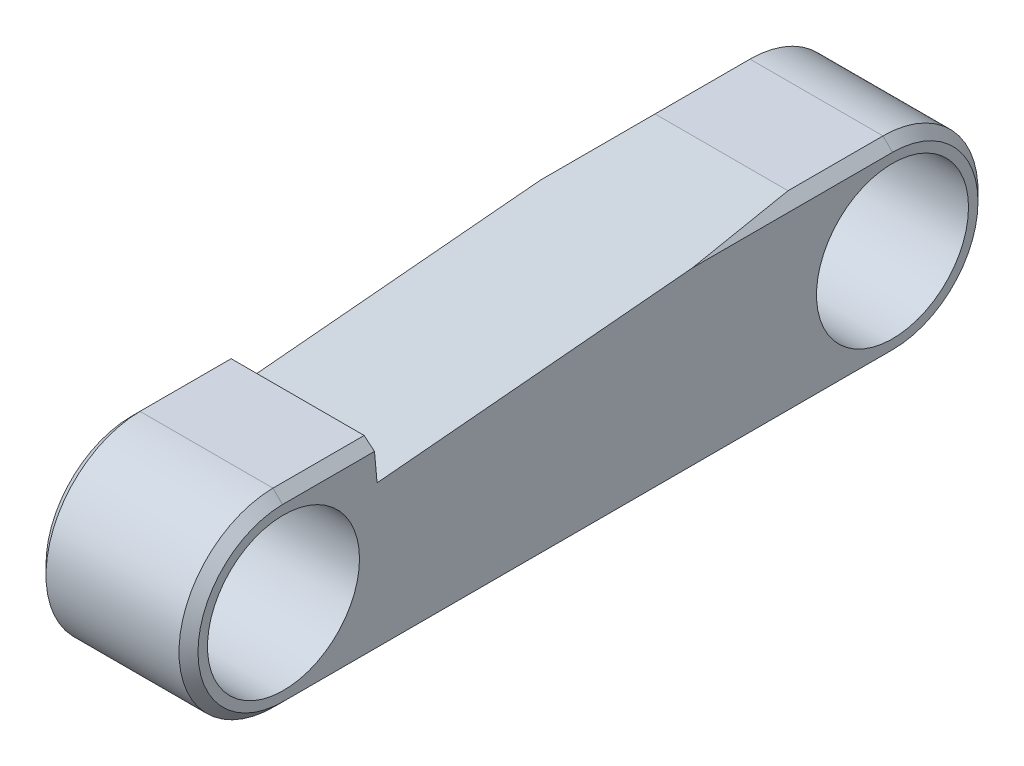
ISO-10303-21;
HEADER;
FILE_DESCRIPTION(('STEP AP214'),'2;1');
FILE_NAME('part.step','',(''),(''),'','','');
FILE_SCHEMA(('AUTOMOTIVE_DESIGN { 1 0 10303 214 1 1 1 1 }'));
ENDSEC;
DATA;
#1=APPLICATION_CONTEXT('core data for automotive mechanical design processes');
#2=APPLICATION_PROTOCOL_DEFINITION('international standard','automotive_design',2000,#1);
#3=PRODUCT_CONTEXT('',#1,'mechanical');
#4=PRODUCT('Part','Part','',(#3));
#5=PRODUCT_RELATED_PRODUCT_CATEGORY('part','',(#4));
#6=PRODUCT_DEFINITION_FORMATION('','',#4);
#7=PRODUCT_DEFINITION_CONTEXT('part definition',#1,'design');
#8=PRODUCT_DEFINITION('design','',#6,#7);
#9=PRODUCT_DEFINITION_SHAPE('','',#8);
#10=(LENGTH_UNIT() NAMED_UNIT(*) SI_UNIT(.MILLI.,.METRE.));
#11=(NAMED_UNIT(*) PLANE_ANGLE_UNIT() SI_UNIT($,.RADIAN.));
#12=(NAMED_UNIT(*) SI_UNIT($,.STERADIAN.) SOLID_ANGLE_UNIT());
#13=UNCERTAINTY_MEASURE_WITH_UNIT(LENGTH_MEASURE(1.E-05),#10,'distance_accuracy_value','');
#14=(GEOMETRIC_REPRESENTATION_CONTEXT(3) GLOBAL_UNCERTAINTY_ASSIGNED_CONTEXT((#13)) GLOBAL_UNIT_ASSIGNED_CONTEXT((#10,
#11,#12)) REPRESENTATION_CONTEXT('',''));
#15=CARTESIAN_POINT('',(0.,0.,0.));
#16=DIRECTION('',(0.,0.,1.));
#17=DIRECTION('',(1.,0.,0.));
#18=AXIS2_PLACEMENT_3D('',#15,#16,#17);
#19=CARTESIAN_POINT('',(8.,0.000592852956836885,-26.9028319761233));
#20=DIRECTION('',(-1.,0.,0.));
#21=DIRECTION('',(0.,0.,1.));
#22=AXIS2_PLACEMENT_3D('',#19,#20,#21);
#23=PLANE('',#22);
#24=CARTESIAN_POINT('',(8.,0.000592852956836885,-26.9028319761233));
#25=DIRECTION('',(-1.,0.,0.));
#26=DIRECTION('',(0.,0.,1.));
#27=AXIS2_PLACEMENT_3D('',#24,#25,#26);
#28=CIRCLE('',#27,4.50000000000001);
#29=CARTESIAN_POINT('',(8.,-4.49940714704317,-26.9028319761233));
#30=VERTEX_POINT('',#29);
#31=CARTESIAN_POINT('',(8.,4.50059285295684,-26.9028319761233));
#32=VERTEX_POINT('',#31);
#33=EDGE_CURVE('E54',#30,#32,#28,.F.);
#34=ORIENTED_EDGE('',*,*,#33,.T.);
#35=DIRECTION('',(0.,0.,1.));
#36=VECTOR('',#35,1.);
#37=CARTESIAN_POINT('',(8.,4.50059285295684,-26.9028319761233));
#38=LINE('',#37,#36);
#39=CARTESIAN_POINT('',(8.,4.50059285295684,-16.3724584459279));
#40=VERTEX_POINT('',#39);
#41=EDGE_CURVE('E11',#32,#40,#38,.T.);
#42=ORIENTED_EDGE('',*,*,#41,.T.);
#43=DIRECTION('',(0.,-0.09004255440515,0.995937918946857));
#44=VECTOR('',#43,1.);
#45=CARTESIAN_POINT('',(8.,5.00059285295684,-21.9028319761233));
#46=LINE('',#45,#44);
#47=CARTESIAN_POINT('',(8.,3.00000021515595,0.225217161472685));
#48=VERTEX_POINT('',#47);
#49=EDGE_CURVE('E139',#40,#48,#46,.T.);
#50=ORIENTED_EDGE('',*,*,#49,.T.);
#51=DIRECTION('',(0.,0.995937918946854,0.0900425544051859));
#52=VECTOR('',#51,1.);
#53=CARTESIAN_POINT('',(8.,3.00000021515595,0.225217161472685));
#54=LINE('',#53,#52);
#55=CARTESIAN_POINT('',(8.,4.50000021515595,0.360831871022656));
#56=VERTEX_POINT('',#55);
#57=EDGE_CURVE('E143',#48,#56,#54,.T.);
#58=ORIENTED_EDGE('',*,*,#57,.T.);
#59=DIRECTION('',(0.,0.,1.));
#60=VECTOR('',#59,1.);
#61=CARTESIAN_POINT('',(8.,4.50000021515596,-26.9028319761233));
#62=LINE('',#61,#60);
#63=CARTESIAN_POINT('',(8.,4.50000021515595,5.20324329658501));
#64=VERTEX_POINT('',#63);
#65=EDGE_CURVE('E254',#56,#64,#62,.T.);
#66=ORIENTED_EDGE('',*,*,#65,.T.);
#67=CARTESIAN_POINT('',(8.,0.000296534056391882,5.15160239904135));
#68=DIRECTION('',(-1.,0.,0.));
#69=DIRECTION('',(0.,0.,1.));
#70=AXIS2_PLACEMENT_3D('',#67,#68,#69);
#71=CIRCLE('',#70,4.50000000000001);
#72=CARTESIAN_POINT('',(8.,-4.49940714704317,5.09996150149768));
#73=VERTEX_POINT('',#72);
#74=EDGE_CURVE('E257',#64,#73,#71,.F.);
#75=ORIENTED_EDGE('',*,*,#74,.T.);
#76=DIRECTION('',(0.,0.,-1.));
#77=VECTOR('',#76,1.);
#78=CARTESIAN_POINT('',(8.,-4.49940714704317,-26.9028319761233));
#79=LINE('',#78,#77);
#80=EDGE_CURVE('E65',#73,#30,#79,.T.);
#81=ORIENTED_EDGE('',*,*,#80,.T.);
#82=EDGE_LOOP('',(#34,#42,#50,#58,#66,#75,#81));
#83=FACE_BOUND('',#82,.T.);
#84=CARTESIAN_POINT('',(8.,0.000592852956836885,-26.9028319761233));
#85=DIRECTION('',(1.,0.,0.));
#86=DIRECTION('',(0.,0.,-1.));
#87=AXIS2_PLACEMENT_3D('',#84,#85,#86);
#88=CIRCLE('',#87,4.);
#89=CARTESIAN_POINT('',(8.,0.000592852956836885,-30.9028319761233));
#90=VERTEX_POINT('',#89);
#91=EDGE_CURVE('E178',#90,#90,#88,.T.);
#92=ORIENTED_EDGE('',*,*,#91,.F.);
#93=EDGE_LOOP('',(#92));
#94=FACE_BOUND('',#93,.T.);
#95=CARTESIAN_POINT('',(8.,0.000296534056391882,5.15160239904135));
#96=DIRECTION('',(1.,0.,0.));
#97=DIRECTION('',(0.,0.,-1.));
#98=AXIS2_PLACEMENT_3D('',#95,#96,#97);
#99=CIRCLE('',#98,3.99999999998631);
#100=CARTESIAN_POINT('',(8.,0.000296534056391882,1.15160239905504));
#101=VERTEX_POINT('',#100);
#102=EDGE_CURVE('E365',#101,#101,#99,.T.);
#103=ORIENTED_EDGE('',*,*,#102,.F.);
#104=EDGE_LOOP('',(#103));
#105=FACE_BOUND('',#104,.T.);
#106=ADVANCED_FACE('F39',(#83,#94,#105),#23,.F.);
#107=CARTESIAN_POINT('',(0.,0.000592852956836885,-26.9028319761233));
#108=DIRECTION('',(-1.,0.,0.));
#109=DIRECTION('',(0.,0.,1.));
#110=AXIS2_PLACEMENT_3D('',#107,#108,#109);
#111=PLANE('',#110);
#112=CARTESIAN_POINT('',(0.,0.000592852956836885,-26.9028319761233));
#113=DIRECTION('',(1.,0.,0.));
#114=DIRECTION('',(0.,0.,-1.));
#115=AXIS2_PLACEMENT_3D('',#112,#113,#114);
#116=CIRCLE('',#115,4.);
#117=CARTESIAN_POINT('',(0.,0.000592852956836885,-30.9028319761233));
#118=VERTEX_POINT('',#117);
#119=EDGE_CURVE('E369',#118,#118,#116,.T.);
#120=ORIENTED_EDGE('',*,*,#119,.T.);
#121=EDGE_LOOP('',(#120));
#122=FACE_BOUND('',#121,.T.);
#123=DIRECTION('',(0.,-0.09004255440515,0.995937918946857));
#124=VECTOR('',#123,1.);
#125=CARTESIAN_POINT('',(0.,5.00059285295684,-21.9028319761233));
#126=LINE('',#125,#124);
#127=CARTESIAN_POINT('',(0.,4.50059285295684,-16.3724584459279));
#128=VERTEX_POINT('',#127);
#129=CARTESIAN_POINT('',(0.,3.00000021515595,0.225217161472685));
#130=VERTEX_POINT('',#129);
#131=EDGE_CURVE('E155',#128,#130,#126,.T.);
#132=ORIENTED_EDGE('',*,*,#131,.F.);
#133=DIRECTION('',(0.,0.,-1.));
#134=VECTOR('',#133,1.);
#135=CARTESIAN_POINT('',(0.,4.50059285295684,-26.9028319761233));
#136=LINE('',#135,#134);
#137=CARTESIAN_POINT('',(0.,4.50059285295684,-26.9028319761233));
#138=VERTEX_POINT('',#137);
#139=EDGE_CURVE('E222',#128,#138,#136,.T.);
#140=ORIENTED_EDGE('',*,*,#139,.T.);
#141=CARTESIAN_POINT('',(0.,0.000592852956836885,-26.9028319761233));
#142=DIRECTION('',(-1.,0.,0.));
#143=DIRECTION('',(0.,0.,1.));
#144=AXIS2_PLACEMENT_3D('',#141,#142,#143);
#145=CIRCLE('',#144,4.5);
#146=CARTESIAN_POINT('',(0.,-4.49940714704317,-26.9028319761233));
#147=VERTEX_POINT('',#146);
#148=EDGE_CURVE('E219',#138,#147,#145,.T.);
#149=ORIENTED_EDGE('',*,*,#148,.T.);
#150=DIRECTION('',(0.,0.,1.));
#151=VECTOR('',#150,1.);
#152=CARTESIAN_POINT('',(0.,-4.49940714704317,5.09716802387673));
#153=LINE('',#152,#151);
#154=CARTESIAN_POINT('',(0.,-4.49940714704317,5.0999615014976));
#155=VERTEX_POINT('',#154);
#156=EDGE_CURVE('E216',#147,#155,#153,.T.);
#157=ORIENTED_EDGE('',*,*,#156,.T.);
#158=CARTESIAN_POINT('',(0.,0.000296534056391882,5.15160239904135));
#159=DIRECTION('',(-1.,0.,0.));
#160=DIRECTION('',(0.,0.,1.));
#161=AXIS2_PLACEMENT_3D('',#158,#159,#160);
#162=CIRCLE('',#161,4.5);
#163=CARTESIAN_POINT('',(0.,4.50000021515595,5.20324329658509));
#164=VERTEX_POINT('',#163);
#165=EDGE_CURVE('E213',#155,#164,#162,.T.);
#166=ORIENTED_EDGE('',*,*,#165,.T.);
#167=DIRECTION('',(0.,0.,-1.));
#168=VECTOR('',#167,1.);
#169=CARTESIAN_POINT('',(0.,4.50000021515595,0.406036774205978));
#170=LINE('',#169,#168);
#171=CARTESIAN_POINT('',(0.,4.50000021515595,0.360831871022655));
#172=VERTEX_POINT('',#171);
#173=EDGE_CURVE('E210',#164,#172,#170,.T.);
#174=ORIENTED_EDGE('',*,*,#173,.T.);
#175=DIRECTION('',(0.,0.995937918946854,0.0900425544051859));
#176=VECTOR('',#175,1.);
#177=CARTESIAN_POINT('',(0.,3.00000021515595,0.225217161472685));
#178=LINE('',#177,#176);
#179=EDGE_CURVE('E148',#130,#172,#178,.T.);
#180=ORIENTED_EDGE('',*,*,#179,.F.);
#181=EDGE_LOOP('',(#132,#140,#149,#157,#166,#174,#180));
#182=FACE_BOUND('',#181,.T.);
#183=CARTESIAN_POINT('',(0.,0.000296534056391882,5.15160239904135));
#184=DIRECTION('',(1.,0.,0.));
#185=DIRECTION('',(0.,0.,-1.));
#186=AXIS2_PLACEMENT_3D('',#183,#184,#185);
#187=CIRCLE('',#186,3.99999999998631);
#188=CARTESIAN_POINT('',(0.,0.000296534056391882,1.15160239905504));
#189=VERTEX_POINT('',#188);
#190=EDGE_CURVE('E362',#189,#189,#187,.T.);
#191=ORIENTED_EDGE('',*,*,#190,.T.);
#192=EDGE_LOOP('',(#191));
#193=FACE_BOUND('',#192,.T.);
#194=ADVANCED_FACE('F381',(#122,#182,#193),#111,.T.);
#195=CARTESIAN_POINT('',(8.,0.000592852956836885,-26.9028319761233));
#196=DIRECTION('',(-1.,0.,0.));
#197=DIRECTION('',(0.,0.,1.));
#198=AXIS2_PLACEMENT_3D('',#195,#196,#197);
#199=CYLINDRICAL_SURFACE('',#198,5.);
#200=DIRECTION('',(-1.,0.,0.));
#201=VECTOR('',#200,1.);
#202=CARTESIAN_POINT('',(8.,-4.99940714704316,-26.9028319761233));
#203=LINE('',#202,#201);
#204=CARTESIAN_POINT('',(7.5,-4.99940714704316,-26.9028319761233));
#205=VERTEX_POINT('',#204);
#206=CARTESIAN_POINT('',(0.499999999999994,-4.99940714704316,-26.9028319761233));
#207=VERTEX_POINT('',#206);
#208=EDGE_CURVE('E168',#205,#207,#203,.T.);
#209=ORIENTED_EDGE('',*,*,#208,.T.);
#210=CARTESIAN_POINT('',(0.499999999999994,0.000592852956836885,-26.9028319761233));
#211=DIRECTION('',(-1.,0.,0.));
#212=DIRECTION('',(0.,0.,1.));
#213=AXIS2_PLACEMENT_3D('',#210,#211,#212);
#214=CIRCLE('',#213,5.);
#215=CARTESIAN_POINT('',(0.499999999999994,5.00059285295684,-26.9028319761233));
#216=VERTEX_POINT('',#215);
#217=EDGE_CURVE('E228',#207,#216,#214,.F.);
#218=ORIENTED_EDGE('',*,*,#217,.T.);
#219=DIRECTION('',(-1.,0.,0.));
#220=VECTOR('',#219,1.);
#221=CARTESIAN_POINT('',(8.,5.00059285295684,-26.9028319761233));
#222=LINE('',#221,#220);
#223=CARTESIAN_POINT('',(7.5,5.00059285295684,-26.9028319761233));
#224=VERTEX_POINT('',#223);
#225=EDGE_CURVE('E193',#224,#216,#222,.T.);
#226=ORIENTED_EDGE('',*,*,#225,.F.);
#227=CARTESIAN_POINT('',(7.5,0.000592852956836885,-26.9028319761233));
#228=DIRECTION('',(-1.,0.,0.));
#229=DIRECTION('',(0.,0.,1.));
#230=AXIS2_PLACEMENT_3D('',#227,#228,#229);
#231=CIRCLE('',#230,5.);
#232=EDGE_CURVE('E225',#224,#205,#231,.T.);
#233=ORIENTED_EDGE('',*,*,#232,.T.);
#234=EDGE_LOOP('',(#209,#218,#226,#233));
#235=FACE_BOUND('',#234,.T.);
#236=ADVANCED_FACE('F336',(#235),#199,.T.);
#237=CARTESIAN_POINT('',(8.,5.00059285295684,-21.9028319761233));
#238=DIRECTION('',(0.,-1.,0.));
#239=DIRECTION('',(0.,0.,-1.));
#240=AXIS2_PLACEMENT_3D('',#237,#238,#239);
#241=PLANE('',#240);
#242=ORIENTED_EDGE('',*,*,#225,.T.);
#243=DIRECTION('',(0.,0.,1.));
#244=VECTOR('',#243,1.);
#245=CARTESIAN_POINT('',(0.499999999999994,5.00059285295684,-21.9028319761233));
#246=LINE('',#245,#244);
#247=CARTESIAN_POINT('',(0.499999999999994,5.00059285295684,-21.9028319761233));
#248=VERTEX_POINT('',#247);
#249=EDGE_CURVE('E200',#216,#248,#246,.T.);
#250=ORIENTED_EDGE('',*,*,#249,.T.);
#251=DIRECTION('',(-1.,0.,0.));
#252=VECTOR('',#251,1.);
#253=CARTESIAN_POINT('',(8.,5.00059285295684,-21.9028319761233));
#254=LINE('',#253,#252);
#255=CARTESIAN_POINT('',(7.5,5.00059285295684,-21.9028319761233));
#256=VERTEX_POINT('',#255);
#257=EDGE_CURVE('E160',#256,#248,#254,.T.);
#258=ORIENTED_EDGE('',*,*,#257,.F.);
#259=DIRECTION('',(0.,0.,-1.));
#260=VECTOR('',#259,1.);
#261=CARTESIAN_POINT('',(7.5,5.00059285295684,-21.9028319761233));
#262=LINE('',#261,#260);
#263=EDGE_CURVE('E197',#256,#224,#262,.T.);
#264=ORIENTED_EDGE('',*,*,#263,.T.);
#265=EDGE_LOOP('',(#242,#250,#258,#264));
#266=FACE_BOUND('',#265,.T.);
#267=ADVANCED_FACE('F396',(#266),#241,.F.);
#268=CARTESIAN_POINT('',(8.,5.00059285295684,-21.9028319761233));
#269=DIRECTION('',(0.,-0.995937918946857,-0.09004255440515));
#270=DIRECTION('',(0.,0.09004255440515,-0.995937918946857));
#271=AXIS2_PLACEMENT_3D('',#268,#269,#270);
#272=PLANE('',#271);
#273=ORIENTED_EDGE('',*,*,#257,.T.);
#274=DIRECTION('',(-0.0896797418113597,-0.0896797418113603,0.991924940616625));
#275=VECTOR('',#274,1.);
#276=CARTESIAN_POINT('',(0.499999999999994,5.00059285295684,-21.9028319761233));
#277=LINE('',#276,#275);
#278=EDGE_CURVE('E207',#248,#128,#277,.T.);
#279=ORIENTED_EDGE('',*,*,#278,.T.);
#280=ORIENTED_EDGE('',*,*,#131,.T.);
#281=DIRECTION('',(-1.,0.,0.));
#282=VECTOR('',#281,1.);
#283=CARTESIAN_POINT('',(8.,3.00000021515595,0.225217161472685));
#284=LINE('',#283,#282);
#285=EDGE_CURVE('E151',#48,#130,#284,.T.);
#286=ORIENTED_EDGE('',*,*,#285,.F.);
#287=ORIENTED_EDGE('',*,*,#49,.F.);
#288=DIRECTION('',(0.089679741811361,-0.0896797418113603,0.991924940616625));
#289=VECTOR('',#288,1.);
#290=CARTESIAN_POINT('',(7.06326459323762,5.43732825971922,-26.733451842639));
#291=LINE('',#290,#289);
#292=EDGE_CURVE('E204',#40,#256,#291,.F.);
#293=ORIENTED_EDGE('',*,*,#292,.T.);
#294=EDGE_LOOP('',(#273,#279,#280,#286,#287,#293));
#295=FACE_BOUND('',#294,.T.);
#296=ADVANCED_FACE('F153',(#295),#272,.F.);
#297=CARTESIAN_POINT('',(8.,3.00000021515595,0.225217161472685));
#298=DIRECTION('',(0.,-0.0900425544051859,0.995937918946853));
#299=DIRECTION('',(0.,-0.995937918946854,-0.0900425544051859));
#300=AXIS2_PLACEMENT_3D('',#297,#298,#299);
#301=PLANE('',#300);
#302=ORIENTED_EDGE('',*,*,#179,.T.);
#303=DIRECTION('',(0.705666234406872,0.705666234406877,0.0637991476122063));
#304=VECTOR('',#303,1.);
#305=CARTESIAN_POINT('',(0.716100340418587,5.21610055557454,0.42557436413899));
#306=LINE('',#305,#304);
#307=CARTESIAN_POINT('',(0.499999999999994,5.00000021515595,0.406036774205978));
#308=VERTEX_POINT('',#307);
#309=EDGE_CURVE('E251',#172,#308,#306,.T.);
#310=ORIENTED_EDGE('',*,*,#309,.T.);
#311=DIRECTION('',(-1.,0.,0.));
#312=VECTOR('',#311,1.);
#313=CARTESIAN_POINT('',(8.,5.00000021515595,0.406036774205978));
#314=LINE('',#313,#312);
#315=CARTESIAN_POINT('',(7.5,5.00000021515595,0.406036774205978));
#316=VERTEX_POINT('',#315);
#317=EDGE_CURVE('E161',#316,#308,#314,.T.);
#318=ORIENTED_EDGE('',*,*,#317,.F.);
#319=DIRECTION('',(-0.705666234406877,0.705666234406872,0.0637991476122058));
#320=VECTOR('',#319,1.);
#321=CARTESIAN_POINT('',(9.22743479967215,3.27256541548381,0.249859728456616));
#322=LINE('',#321,#320);
#323=EDGE_CURVE('E166',#316,#56,#322,.F.);
#324=ORIENTED_EDGE('',*,*,#323,.T.);
#325=ORIENTED_EDGE('',*,*,#57,.F.);
#326=ORIENTED_EDGE('',*,*,#285,.T.);
#327=EDGE_LOOP('',(#302,#310,#318,#324,#325,#326));
#328=FACE_BOUND('',#327,.T.);
#329=ADVANCED_FACE('F163',(#328),#301,.F.);
#330=CARTESIAN_POINT('',(8.,5.00000021515595,5.20603677420597));
#331=DIRECTION('',(0.,-1.,0.));
#332=DIRECTION('',(0.,0.,-1.));
#333=AXIS2_PLACEMENT_3D('',#330,#331,#332);
#334=PLANE('',#333);
#335=ORIENTED_EDGE('',*,*,#317,.T.);
#336=DIRECTION('',(0.,0.,1.));
#337=VECTOR('',#336,1.);
#338=CARTESIAN_POINT('',(0.499999999999994,5.00000021515595,5.20603677420597));
#339=LINE('',#338,#337);
#340=CARTESIAN_POINT('',(0.499999999999994,5.00000021515595,5.20603677420597));
#341=VERTEX_POINT('',#340);
#342=EDGE_CURVE('E246',#308,#341,#339,.T.);
#343=ORIENTED_EDGE('',*,*,#342,.T.);
#344=DIRECTION('',(-1.,0.,0.));
#345=VECTOR('',#344,1.);
#346=CARTESIAN_POINT('',(8.,5.00000021515595,5.20603677420597));
#347=LINE('',#346,#345);
#348=CARTESIAN_POINT('',(7.5,5.00000021515595,5.20603677420597));
#349=VERTEX_POINT('',#348);
#350=EDGE_CURVE('E184',#349,#341,#347,.T.);
#351=ORIENTED_EDGE('',*,*,#350,.F.);
#352=DIRECTION('',(0.,0.,-1.));
#353=VECTOR('',#352,1.);
#354=CARTESIAN_POINT('',(7.5,5.00000021515595,5.20603677420597));
#355=LINE('',#354,#353);
#356=EDGE_CURVE('E243',#349,#316,#355,.T.);
#357=ORIENTED_EDGE('',*,*,#356,.T.);
#358=EDGE_LOOP('',(#335,#343,#351,#357));
#359=FACE_BOUND('',#358,.T.);
#360=ADVANCED_FACE('F355',(#359),#334,.F.);
#361=CARTESIAN_POINT('',(8.,0.000296534056391882,5.15160239904135));
#362=DIRECTION('',(-1.,0.,0.));
#363=DIRECTION('',(0.,0.,1.));
#364=AXIS2_PLACEMENT_3D('',#361,#362,#363);
#365=CYLINDRICAL_SURFACE('',#364,5.);
#366=ORIENTED_EDGE('',*,*,#350,.T.);
#367=CARTESIAN_POINT('',(0.499999999999994,0.000296534056391882,5.15160239904135));
#368=DIRECTION('',(-1.,0.,0.));
#369=DIRECTION('',(0.,0.,1.));
#370=AXIS2_PLACEMENT_3D('',#367,#368,#369);
#371=CIRCLE('',#370,5.);
#372=CARTESIAN_POINT('',(0.499999999999994,-4.99940714704316,5.09716802387673));
#373=VERTEX_POINT('',#372);
#374=EDGE_CURVE('E240',#341,#373,#371,.F.);
#375=ORIENTED_EDGE('',*,*,#374,.T.);
#376=DIRECTION('',(-1.,0.,0.));
#377=VECTOR('',#376,1.);
#378=CARTESIAN_POINT('',(8.,-4.99940714704316,5.09716802387673));
#379=LINE('',#378,#377);
#380=CARTESIAN_POINT('',(7.5,-4.99940714704316,5.09716802387673));
#381=VERTEX_POINT('',#380);
#382=EDGE_CURVE('E172',#381,#373,#379,.T.);
#383=ORIENTED_EDGE('',*,*,#382,.F.);
#384=CARTESIAN_POINT('',(7.5,0.000296534056391882,5.15160239904135));
#385=DIRECTION('',(-1.,0.,0.));
#386=DIRECTION('',(0.,0.,1.));
#387=AXIS2_PLACEMENT_3D('',#384,#385,#386);
#388=CIRCLE('',#387,5.);
#389=EDGE_CURVE('E237',#381,#349,#388,.T.);
#390=ORIENTED_EDGE('',*,*,#389,.T.);
#391=EDGE_LOOP('',(#366,#375,#383,#390));
#392=FACE_BOUND('',#391,.T.);
#393=ADVANCED_FACE('F351',(#392),#365,.T.);
#394=CARTESIAN_POINT('',(8.,-4.99940714704316,5.09716802387673));
#395=DIRECTION('',(0.,1.,0.));
#396=DIRECTION('',(0.,0.,1.));
#397=AXIS2_PLACEMENT_3D('',#394,#395,#396);
#398=PLANE('',#397);
#399=ORIENTED_EDGE('',*,*,#382,.T.);
#400=DIRECTION('',(0.,0.,-1.));
#401=VECTOR('',#400,1.);
#402=CARTESIAN_POINT('',(0.499999999999994,-4.99940714704316,-26.9028319761233));
#403=LINE('',#402,#401);
#404=EDGE_CURVE('E234',#373,#207,#403,.T.);
#405=ORIENTED_EDGE('',*,*,#404,.T.);
#406=ORIENTED_EDGE('',*,*,#208,.F.);
#407=DIRECTION('',(0.,0.,1.));
#408=VECTOR('',#407,1.);
#409=CARTESIAN_POINT('',(7.5,-4.99940714704316,5.09716802387673));
#410=LINE('',#409,#408);
#411=EDGE_CURVE('E231',#205,#381,#410,.T.);
#412=ORIENTED_EDGE('',*,*,#411,.T.);
#413=EDGE_LOOP('',(#399,#405,#406,#412));
#414=FACE_BOUND('',#413,.T.);
#415=ADVANCED_FACE('F340',(#414),#398,.F.);
#416=CARTESIAN_POINT('',(8.,0.000592852956836885,-26.9028319761233));
#417=DIRECTION('',(-1.,0.,0.));
#418=DIRECTION('',(0.,0.,1.));
#419=AXIS2_PLACEMENT_3D('',#416,#417,#418);
#420=CYLINDRICAL_SURFACE('',#419,4.);
#421=ORIENTED_EDGE('',*,*,#91,.T.);
#422=EDGE_LOOP('',(#421));
#423=FACE_BOUND('',#422,.T.);
#424=ORIENTED_EDGE('',*,*,#119,.F.);
#425=EDGE_LOOP('',(#424));
#426=FACE_BOUND('',#425,.T.);
#427=ADVANCED_FACE('F377',(#423,#426),#420,.F.);
#428=CARTESIAN_POINT('',(8.,0.000296534056391882,5.15160239904135));
#429=DIRECTION('',(-1.,0.,0.));
#430=DIRECTION('',(0.,0.,1.));
#431=AXIS2_PLACEMENT_3D('',#428,#429,#430);
#432=CYLINDRICAL_SURFACE('',#431,3.99999999998631);
#433=ORIENTED_EDGE('',*,*,#102,.T.);
#434=EDGE_LOOP('',(#433));
#435=FACE_BOUND('',#434,.T.);
#436=ORIENTED_EDGE('',*,*,#190,.F.);
#437=EDGE_LOOP('',(#436));
#438=FACE_BOUND('',#437,.T.);
#439=ADVANCED_FACE('F301',(#435,#438),#432,.F.);
#440=CARTESIAN_POINT('',(0.499999999999994,5.00000021515595,5.20603677420597));
#441=DIRECTION('',(-0.70710678118655,0.707106781186545,0.));
#442=DIRECTION('',(0.,0.,-1.));
#443=AXIS2_PLACEMENT_3D('',#440,#441,#442);
#444=PLANE('',#443);
#445=ORIENTED_EDGE('',*,*,#309,.F.);
#446=ORIENTED_EDGE('',*,*,#173,.F.);
#447=CARTESIAN_POINT('',(0.,4.50000021515595,5.20324329658509));
#448=CARTESIAN_POINT('',(0.0833332990949775,4.58333351425093,5.20372113697152));
#449=CARTESIAN_POINT('',(0.166666615315066,4.66666683047102,5.20419284696651));
#450=CARTESIAN_POINT('',(0.333333281981731,4.83333349713768,5.20512400617347));
#451=CARTESIAN_POINT('',(0.416666632428307,4.91666684758426,5.20558345538544));
#452=CARTESIAN_POINT('',(0.499999999999994,5.00000021515595,5.20603677420598));
#453=B_SPLINE_CURVE_WITH_KNOTS('',3,(#447,#448,#449,#450,#451,#452),.UNSPECIFIED.,.F.,.F.,(4,2,
4),(0.,0.353556150071169,0.707112300041635),.UNSPECIFIED.);
#454=EDGE_CURVE('E282',#341,#164,#453,.F.);
#455=ORIENTED_EDGE('',*,*,#454,.F.);
#456=ORIENTED_EDGE('',*,*,#342,.F.);
#457=EDGE_LOOP('',(#445,#446,#455,#456));
#458=FACE_BOUND('',#457,.T.);
#459=ADVANCED_FACE('F295',(#458),#444,.T.);
#460=CARTESIAN_POINT('',(0.499999999999994,0.000296534056391882,5.15160239904135));
#461=DIRECTION('',(1.,0.,0.));
#462=DIRECTION('',(0.,0.,-1.));
#463=AXIS2_PLACEMENT_3D('',#460,#461,#462);
#464=CONICAL_SURFACE('',#463,5.,0.785398163397452);
#465=ORIENTED_EDGE('',*,*,#454,.T.);
#466=ORIENTED_EDGE('',*,*,#165,.F.);
#467=CARTESIAN_POINT('',(0.,-4.49940714704317,5.0999615014976));
#468=CARTESIAN_POINT('',(0.0833332990949775,-4.58274044613814,5.09948366111116));
#469=CARTESIAN_POINT('',(0.166666615315066,-4.66607376235823,5.09901195111616));
#470=CARTESIAN_POINT('',(0.333333281981731,-4.8327404290249,5.09808079190919));
#471=CARTESIAN_POINT('',(0.416666632428306,-4.91607377947147,5.09762134269721));
#472=CARTESIAN_POINT('',(0.499999999999993,-4.99940714704316,5.09716802387667));
#473=B_SPLINE_CURVE_WITH_KNOTS('',3,(#467,#468,#469,#470,#471,#472),.UNSPECIFIED.,.F.,.F.,(4,2,
4),(0.,0.353556150071169,0.707112300041635),.UNSPECIFIED.);
#474=EDGE_CURVE('E272',#373,#155,#473,.F.);
#475=ORIENTED_EDGE('',*,*,#474,.F.);
#476=ORIENTED_EDGE('',*,*,#374,.F.);
#477=EDGE_LOOP('',(#465,#466,#475,#476));
#478=FACE_BOUND('',#477,.T.);
#479=ADVANCED_FACE('F292',(#478),#464,.T.);
#480=CARTESIAN_POINT('',(0.499999999999994,-4.99940714704316,5.09716802387673));
#481=DIRECTION('',(-0.70710678118655,-0.707106781186545,0.));
#482=DIRECTION('',(0.,0.,1.));
#483=AXIS2_PLACEMENT_3D('',#480,#481,#482);
#484=PLANE('',#483);
#485=ORIENTED_EDGE('',*,*,#474,.T.);
#486=ORIENTED_EDGE('',*,*,#156,.F.);
#487=DIRECTION('',(-0.707106781186545,0.70710678118655,0.));
#488=VECTOR('',#487,1.);
#489=CARTESIAN_POINT('',(0.499999999999994,-4.99940714704316,-26.9028319761233));
#490=LINE('',#489,#488);
#491=EDGE_CURVE('E268',#207,#147,#490,.T.);
#492=ORIENTED_EDGE('',*,*,#491,.F.);
#493=ORIENTED_EDGE('',*,*,#404,.F.);
#494=EDGE_LOOP('',(#485,#486,#492,#493));
#495=FACE_BOUND('',#494,.T.);
#496=ADVANCED_FACE('F289',(#495),#484,.T.);
#497=CARTESIAN_POINT('',(0.499999999999994,0.000592852956836885,-26.9028319761233));
#498=DIRECTION('',(1.,0.,0.));
#499=DIRECTION('',(0.,0.,-1.));
#500=AXIS2_PLACEMENT_3D('',#497,#498,#499);
#501=CONICAL_SURFACE('',#500,5.,0.785398163397452);
#502=ORIENTED_EDGE('',*,*,#491,.T.);
#503=ORIENTED_EDGE('',*,*,#148,.F.);
#504=DIRECTION('',(-0.707106781186545,-0.70710678118655,0.));
#505=VECTOR('',#504,1.);
#506=CARTESIAN_POINT('',(0.499999999999994,5.00059285295684,-26.9028319761233));
#507=LINE('',#506,#505);
#508=EDGE_CURVE('E264',#216,#138,#507,.T.);
#509=ORIENTED_EDGE('',*,*,#508,.F.);
#510=ORIENTED_EDGE('',*,*,#217,.F.);
#511=EDGE_LOOP('',(#502,#503,#509,#510));
#512=FACE_BOUND('',#511,.T.);
#513=ADVANCED_FACE('F416',(#512),#501,.T.);
#514=CARTESIAN_POINT('',(0.499999999999994,5.00059285295684,-21.9028319761233));
#515=DIRECTION('',(-0.70710678118655,0.707106781186545,0.));
#516=DIRECTION('',(0.,0.,-1.));
#517=AXIS2_PLACEMENT_3D('',#514,#515,#516);
#518=PLANE('',#517);
#519=ORIENTED_EDGE('',*,*,#508,.T.);
#520=ORIENTED_EDGE('',*,*,#139,.F.);
#521=ORIENTED_EDGE('',*,*,#278,.F.);
#522=ORIENTED_EDGE('',*,*,#249,.F.);
#523=EDGE_LOOP('',(#519,#520,#521,#522));
#524=FACE_BOUND('',#523,.T.);
#525=ADVANCED_FACE('F414',(#524),#518,.T.);
#526=CARTESIAN_POINT('',(8.,4.50000021515596,-26.9028319761233));
#527=DIRECTION('',(-0.707106781186545,-0.70710678118655,0.));
#528=DIRECTION('',(0.,0.,1.));
#529=AXIS2_PLACEMENT_3D('',#526,#527,#528);
#530=PLANE('',#529);
#531=ORIENTED_EDGE('',*,*,#323,.F.);
#532=ORIENTED_EDGE('',*,*,#356,.F.);
#533=CARTESIAN_POINT('',(7.5,5.00000021515595,5.20603677420597));
#534=CARTESIAN_POINT('',(7.58333336757169,4.91666684758426,5.20558345538544));
#535=CARTESIAN_POINT('',(7.66666671801827,4.83333349713768,5.20512400617346));
#536=CARTESIAN_POINT('',(7.83333338468493,4.66666683047102,5.20419284696647));
#537=CARTESIAN_POINT('',(7.91666670090502,4.58333351425093,5.20372113697146));
#538=CARTESIAN_POINT('',(8.,4.50000021515595,5.203243296585));
#539=B_SPLINE_CURVE_WITH_KNOTS('',3,(#533,#534,#535,#536,#537,#538),.UNSPECIFIED.,.F.,.F.,(4,2,
4),(0.,0.353556149970466,0.707112300041635),.UNSPECIFIED.);
#540=EDGE_CURVE('E44',#64,#349,#539,.F.);
#541=ORIENTED_EDGE('',*,*,#540,.F.);
#542=ORIENTED_EDGE('',*,*,#65,.F.);
#543=EDGE_LOOP('',(#531,#532,#541,#542));
#544=FACE_BOUND('',#543,.T.);
#545=ADVANCED_FACE('F41',(#544),#530,.F.);
#546=CARTESIAN_POINT('',(8.,0.000296534056391882,5.15160239904135));
#547=DIRECTION('',(-1.,0.,0.));
#548=DIRECTION('',(0.,0.,1.));
#549=AXIS2_PLACEMENT_3D('',#546,#547,#548);
#550=CONICAL_SURFACE('',#549,4.50000000000001,0.785398163397446);
#551=ORIENTED_EDGE('',*,*,#540,.T.);
#552=ORIENTED_EDGE('',*,*,#389,.F.);
#553=CARTESIAN_POINT('',(7.5,-4.99940714704316,5.09716802387673));
#554=CARTESIAN_POINT('',(7.58333336757169,-4.91607377947147,5.09762134269728));
#555=CARTESIAN_POINT('',(7.66666671801827,-4.8327404290249,5.09808079190927));
#556=CARTESIAN_POINT('',(7.83333338468493,-4.66607376235824,5.09901195111623));
#557=CARTESIAN_POINT('',(7.91666670090502,-4.58274044613815,5.09948366111122));
#558=CARTESIAN_POINT('',(8.,-4.49940714704317,5.09996150149763));
#559=B_SPLINE_CURVE_WITH_KNOTS('',3,(#553,#554,#555,#556,#557,#558),.UNSPECIFIED.,.F.,.F.,(4,2,
4),(0.,0.353556149970466,0.707112300041635),.UNSPECIFIED.);
#560=EDGE_CURVE('E317',#73,#381,#559,.F.);
#561=ORIENTED_EDGE('',*,*,#560,.F.);
#562=ORIENTED_EDGE('',*,*,#74,.F.);
#563=EDGE_LOOP('',(#551,#552,#561,#562));
#564=FACE_BOUND('',#563,.T.);
#565=ADVANCED_FACE('F314',(#564),#550,.T.);
#566=CARTESIAN_POINT('',(8.,-4.49940714704317,-26.9028319761233));
#567=DIRECTION('',(-0.707106781186545,0.70710678118655,0.));
#568=DIRECTION('',(0.,0.,-1.));
#569=AXIS2_PLACEMENT_3D('',#566,#567,#568);
#570=PLANE('',#569);
#571=ORIENTED_EDGE('',*,*,#560,.T.);
#572=ORIENTED_EDGE('',*,*,#411,.F.);
#573=DIRECTION('',(-0.70710678118655,-0.707106781186545,0.));
#574=VECTOR('',#573,1.);
#575=CARTESIAN_POINT('',(8.,-4.49940714704317,-26.9028319761233));
#576=LINE('',#575,#574);
#577=EDGE_CURVE('E325',#30,#205,#576,.T.);
#578=ORIENTED_EDGE('',*,*,#577,.F.);
#579=ORIENTED_EDGE('',*,*,#80,.F.);
#580=EDGE_LOOP('',(#571,#572,#578,#579));
#581=FACE_BOUND('',#580,.T.);
#582=ADVANCED_FACE('F310',(#581),#570,.F.);
#583=CARTESIAN_POINT('',(8.,0.000592852956836885,-26.9028319761233));
#584=DIRECTION('',(-1.,0.,0.));
#585=DIRECTION('',(0.,0.,1.));
#586=AXIS2_PLACEMENT_3D('',#583,#584,#585);
#587=CONICAL_SURFACE('',#586,4.50000000000001,0.785398163397445);
#588=ORIENTED_EDGE('',*,*,#577,.T.);
#589=ORIENTED_EDGE('',*,*,#232,.F.);
#590=DIRECTION('',(-0.70710678118655,0.707106781186545,0.));
#591=VECTOR('',#590,1.);
#592=CARTESIAN_POINT('',(8.,4.50059285295684,-26.9028319761233));
#593=LINE('',#592,#591);
#594=EDGE_CURVE('E328',#32,#224,#593,.T.);
#595=ORIENTED_EDGE('',*,*,#594,.F.);
#596=ORIENTED_EDGE('',*,*,#33,.F.);
#597=EDGE_LOOP('',(#588,#589,#595,#596));
#598=FACE_BOUND('',#597,.T.);
#599=ADVANCED_FACE('F306',(#598),#587,.T.);
#600=CARTESIAN_POINT('',(8.,4.50059285295684,-26.9028319761233));
#601=DIRECTION('',(-0.707106781186545,-0.70710678118655,0.));
#602=DIRECTION('',(0.,0.,1.));
#603=AXIS2_PLACEMENT_3D('',#600,#601,#602);
#604=PLANE('',#603);
#605=ORIENTED_EDGE('',*,*,#594,.T.);
#606=ORIENTED_EDGE('',*,*,#263,.F.);
#607=ORIENTED_EDGE('',*,*,#292,.F.);
#608=ORIENTED_EDGE('',*,*,#41,.F.);
#609=EDGE_LOOP('',(#605,#606,#607,#608));
#610=FACE_BOUND('',#609,.T.);
#611=ADVANCED_FACE('F303',(#610),#604,.F.);
#612=CLOSED_SHELL('',(#106,#194,#236,#267,#296,#329,#360,#393,#415,#427,#439,#459,#479,#496,
#513,#525,#545,#565,#582,#599,#611));
#613=MANIFOLD_SOLID_BREP('B2',#612);
#614=ADVANCED_BREP_SHAPE_REPRESENTATION('',(#18,#613),#14);
#615=SHAPE_DEFINITION_REPRESENTATION(#9,#614);
ENDSEC;
END-ISO-10303-21;
